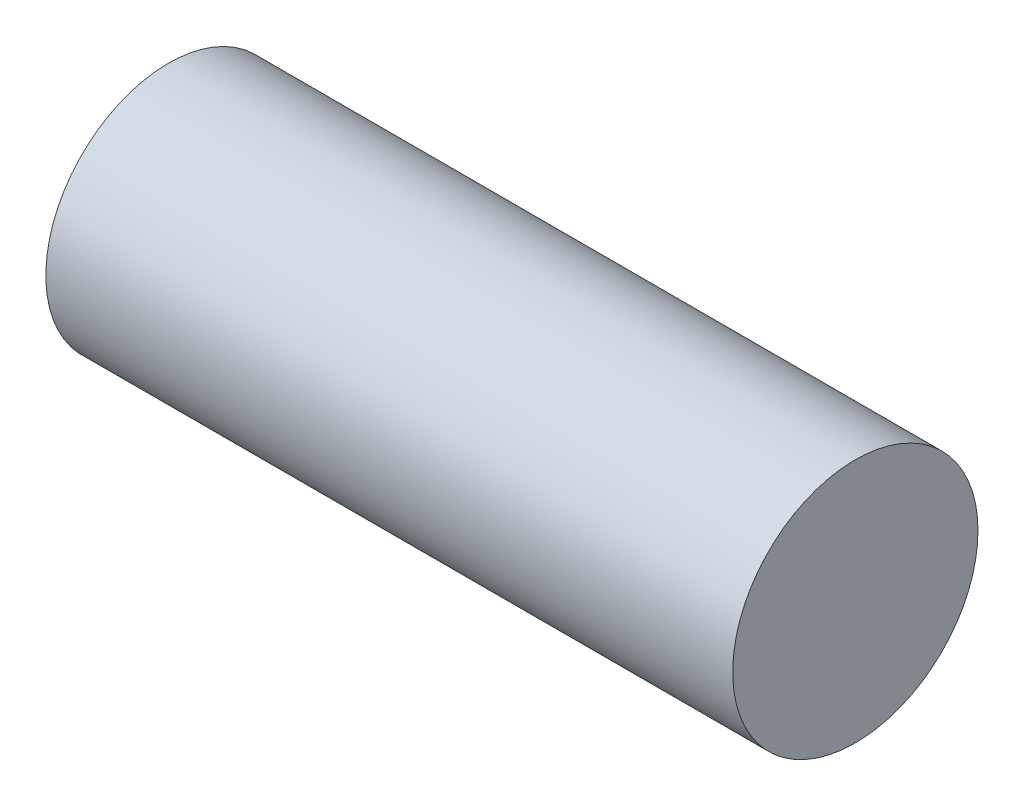
ISO-10303-21;
HEADER;
FILE_DESCRIPTION(('STEP AP214'),'2;1');
FILE_NAME('part.step','',(''),(''),'','','');
FILE_SCHEMA(('AUTOMOTIVE_DESIGN { 1 0 10303 214 1 1 1 1 }'));
ENDSEC;
DATA;
#1=APPLICATION_CONTEXT('core data for automotive mechanical design processes');
#2=APPLICATION_PROTOCOL_DEFINITION('international standard','automotive_design',2000,#1);
#3=PRODUCT_CONTEXT('',#1,'mechanical');
#4=PRODUCT('Part','Part','',(#3));
#5=PRODUCT_RELATED_PRODUCT_CATEGORY('part','',(#4));
#6=PRODUCT_DEFINITION_FORMATION('','',#4);
#7=PRODUCT_DEFINITION_CONTEXT('part definition',#1,'design');
#8=PRODUCT_DEFINITION('design','',#6,#7);
#9=PRODUCT_DEFINITION_SHAPE('','',#8);
#10=(LENGTH_UNIT() NAMED_UNIT(*) SI_UNIT(.MILLI.,.METRE.));
#11=(NAMED_UNIT(*) PLANE_ANGLE_UNIT() SI_UNIT($,.RADIAN.));
#12=(NAMED_UNIT(*) SI_UNIT($,.STERADIAN.) SOLID_ANGLE_UNIT());
#13=UNCERTAINTY_MEASURE_WITH_UNIT(LENGTH_MEASURE(1.E-05),#10,'distance_accuracy_value','');
#14=(GEOMETRIC_REPRESENTATION_CONTEXT(3) GLOBAL_UNCERTAINTY_ASSIGNED_CONTEXT((#13)) GLOBAL_UNIT_ASSIGNED_CONTEXT((#10,
#11,#12)) REPRESENTATION_CONTEXT('',''));
#15=CARTESIAN_POINT('',(0.,0.,0.));
#16=DIRECTION('',(0.,0.,1.));
#17=DIRECTION('',(1.,0.,0.));
#18=AXIS2_PLACEMENT_3D('',#15,#16,#17);
#19=CARTESIAN_POINT('',(8.89,0.,0.));
#20=DIRECTION('',(-1.,0.,0.));
#21=DIRECTION('',(0.,0.,1.));
#22=AXIS2_PLACEMENT_3D('',#19,#20,#21);
#23=CYLINDRICAL_SURFACE('',#22,3.175);
#24=CARTESIAN_POINT('',(8.89,0.,0.));
#25=DIRECTION('',(1.,0.,0.));
#26=DIRECTION('',(0.,0.,-1.));
#27=AXIS2_PLACEMENT_3D('',#24,#25,#26);
#28=CIRCLE('',#27,3.175);
#29=CARTESIAN_POINT('',(8.89,0.,-3.175));
#30=VERTEX_POINT('',#29);
#31=EDGE_CURVE('E10',#30,#30,#28,.T.);
#32=ORIENTED_EDGE('',*,*,#31,.F.);
#33=EDGE_LOOP('',(#32));
#34=FACE_BOUND('',#33,.T.);
#35=CARTESIAN_POINT('',(-8.89,0.,0.));
#36=DIRECTION('',(1.,0.,0.));
#37=DIRECTION('',(0.,0.,-1.));
#38=AXIS2_PLACEMENT_3D('',#35,#36,#37);
#39=CIRCLE('',#38,3.175);
#40=CARTESIAN_POINT('',(-8.89,0.,-3.175));
#41=VERTEX_POINT('',#40);
#42=EDGE_CURVE('E46',#41,#41,#39,.T.);
#43=ORIENTED_EDGE('',*,*,#42,.T.);
#44=EDGE_LOOP('',(#43));
#45=FACE_BOUND('',#44,.T.);
#46=ADVANCED_FACE('F43',(#34,#45),#23,.T.);
#47=CARTESIAN_POINT('',(8.89,0.,0.));
#48=DIRECTION('',(1.,0.,0.));
#49=DIRECTION('',(0.,0.,-1.));
#50=AXIS2_PLACEMENT_3D('',#47,#48,#49);
#51=PLANE('',#50);
#52=ORIENTED_EDGE('',*,*,#31,.T.);
#53=EDGE_LOOP('',(#52));
#54=FACE_BOUND('',#53,.T.);
#55=ADVANCED_FACE('F60',(#54),#51,.T.);
#56=CARTESIAN_POINT('',(-8.89,0.,0.));
#57=DIRECTION('',(1.,0.,0.));
#58=DIRECTION('',(0.,0.,-1.));
#59=AXIS2_PLACEMENT_3D('',#56,#57,#58);
#60=PLANE('',#59);
#61=ORIENTED_EDGE('',*,*,#42,.F.);
#62=EDGE_LOOP('',(#61));
#63=FACE_BOUND('',#62,.T.);
#64=ADVANCED_FACE('F58',(#63),#60,.F.);
#65=CLOSED_SHELL('',(#46,#55,#64));
#66=MANIFOLD_SOLID_BREP('B2',#65);
#67=ADVANCED_BREP_SHAPE_REPRESENTATION('',(#18,#66),#14);
#68=SHAPE_DEFINITION_REPRESENTATION(#9,#67);
ENDSEC;
END-ISO-10303-21;
